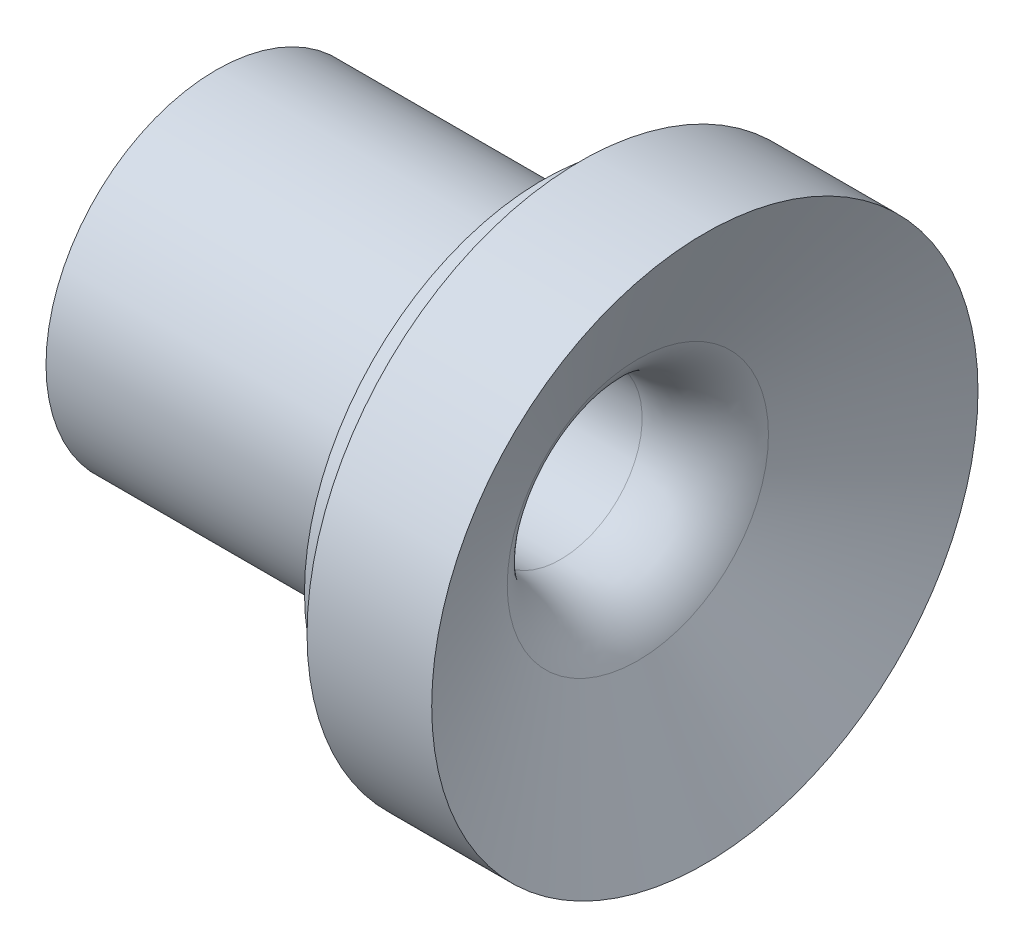
ISO-10303-21;
HEADER;
FILE_DESCRIPTION(('STEP AP214'),'2;1');
FILE_NAME('part.step','',(''),(''),'','','');
FILE_SCHEMA(('AUTOMOTIVE_DESIGN { 1 0 10303 214 1 1 1 1 }'));
ENDSEC;
DATA;
#1=APPLICATION_CONTEXT('core data for automotive mechanical design processes');
#2=APPLICATION_PROTOCOL_DEFINITION('international standard','automotive_design',2000,#1);
#3=PRODUCT_CONTEXT('',#1,'mechanical');
#4=PRODUCT('Part','Part','',(#3));
#5=PRODUCT_RELATED_PRODUCT_CATEGORY('part','',(#4));
#6=PRODUCT_DEFINITION_FORMATION('','',#4);
#7=PRODUCT_DEFINITION_CONTEXT('part definition',#1,'design');
#8=PRODUCT_DEFINITION('design','',#6,#7);
#9=PRODUCT_DEFINITION_SHAPE('','',#8);
#10=(LENGTH_UNIT() NAMED_UNIT(*) SI_UNIT(.MILLI.,.METRE.));
#11=(NAMED_UNIT(*) PLANE_ANGLE_UNIT() SI_UNIT($,.RADIAN.));
#12=(NAMED_UNIT(*) SI_UNIT($,.STERADIAN.) SOLID_ANGLE_UNIT());
#13=UNCERTAINTY_MEASURE_WITH_UNIT(LENGTH_MEASURE(1.E-05),#10,'distance_accuracy_value','');
#14=(GEOMETRIC_REPRESENTATION_CONTEXT(3) GLOBAL_UNCERTAINTY_ASSIGNED_CONTEXT((#13)) GLOBAL_UNIT_ASSIGNED_CONTEXT((#10,
#11,#12)) REPRESENTATION_CONTEXT('',''));
#15=CARTESIAN_POINT('',(0.,0.,0.));
#16=DIRECTION('',(0.,0.,1.));
#17=DIRECTION('',(1.,0.,0.));
#18=AXIS2_PLACEMENT_3D('',#15,#16,#17);
#19=CARTESIAN_POINT('',(4.26117287731068,15.2309957839257,0.));
#20=DIRECTION('',(1.,0.,0.));
#21=DIRECTION('',(0.,0.,-1.));
#22=AXIS2_PLACEMENT_3D('',#19,#20,#21);
#23=PLANE('',#22);
#24=CARTESIAN_POINT('',(4.26117287731068,-3.82202264007431,0.));
#25=DIRECTION('',(-1.,0.,0.));
#26=DIRECTION('',(0.,0.,1.));
#27=AXIS2_PLACEMENT_3D('',#24,#25,#26);
#28=CIRCLE('',#27,19.053018424);
#29=CARTESIAN_POINT('',(4.26117287731068,-3.82202264007431,19.053018424));
#30=VERTEX_POINT('',#29);
#31=EDGE_CURVE('E93',#30,#30,#28,.T.);
#32=ORIENTED_EDGE('',*,*,#31,.F.);
#33=EDGE_LOOP('',(#32));
#34=FACE_BOUND('',#33,.T.);
#35=CARTESIAN_POINT('',(4.26117287731068,-3.82202264007431,0.));
#36=DIRECTION('',(-1.,0.,0.));
#37=DIRECTION('',(0.,0.,1.));
#38=AXIS2_PLACEMENT_3D('',#35,#36,#37);
#39=CIRCLE('',#38,21.8372704);
#40=CARTESIAN_POINT('',(4.26117287731068,-3.82202264007431,21.8372704));
#41=VERTEX_POINT('',#40);
#42=EDGE_CURVE('E10',#41,#41,#39,.T.);
#43=ORIENTED_EDGE('',*,*,#42,.T.);
#44=EDGE_LOOP('',(#43));
#45=FACE_BOUND('',#44,.T.);
#46=ADVANCED_FACE('F38',(#34,#45),#23,.F.);
#47=CARTESIAN_POINT('',(-32.3479949938202,-3.82202264007431,0.));
#48=DIRECTION('',(-1.,0.,0.));
#49=DIRECTION('',(0.,0.,1.));
#50=AXIS2_PLACEMENT_3D('',#47,#48,#49);
#51=CYLINDRICAL_SURFACE('',#50,21.8372704);
#52=ORIENTED_EDGE('',*,*,#42,.F.);
#53=EDGE_LOOP('',(#52));
#54=FACE_BOUND('',#53,.T.);
#55=CARTESIAN_POINT('',(14.2274983634607,-3.82202264007431,0.));
#56=DIRECTION('',(-1.,0.,0.));
#57=DIRECTION('',(0.,0.,1.));
#58=AXIS2_PLACEMENT_3D('',#55,#56,#57);
#59=CIRCLE('',#58,21.8372704);
#60=CARTESIAN_POINT('',(14.2274983634607,-3.82202264007431,21.8372704));
#61=VERTEX_POINT('',#60);
#62=EDGE_CURVE('E45',#61,#61,#59,.T.);
#63=ORIENTED_EDGE('',*,*,#62,.T.);
#64=EDGE_LOOP('',(#63));
#65=FACE_BOUND('',#64,.T.);
#66=ADVANCED_FACE('F101',(#54,#65),#51,.T.);
#67=CARTESIAN_POINT('',(8.87115099573555,-3.82202264007431,0.));
#68=DIRECTION('',(1.,0.,0.));
#69=DIRECTION('',(0.,0.,-1.));
#70=AXIS2_PLACEMENT_3D('',#67,#68,#69);
#71=CONICAL_SURFACE('',#70,10.4417335755133,1.13140345075348);
#72=ORIENTED_EDGE('',*,*,#62,.F.);
#73=EDGE_LOOP('',(#72));
#74=FACE_BOUND('',#73,.T.);
#75=CARTESIAN_POINT('',(8.87115099573555,-3.82202264007431,0.));
#76=DIRECTION('',(-1.,0.,0.));
#77=DIRECTION('',(0.,0.,1.));
#78=AXIS2_PLACEMENT_3D('',#75,#76,#77);
#79=CIRCLE('',#78,10.4417335755133);
#80=CARTESIAN_POINT('',(8.87115099573555,-3.82202264007431,10.4417335755133));
#81=VERTEX_POINT('',#80);
#82=EDGE_CURVE('E50',#81,#81,#79,.T.);
#83=ORIENTED_EDGE('',*,*,#82,.T.);
#84=EDGE_LOOP('',(#83));
#85=FACE_BOUND('',#84,.T.);
#86=ADVANCED_FACE('F105',(#74,#85),#71,.F.);
#87=CARTESIAN_POINT('',(2.69522907429682,-3.82202264007431,0.));
#88=DIRECTION('',(-1.,0.,0.));
#89=DIRECTION('',(0.,0.,1.));
#90=AXIS2_PLACEMENT_3D('',#87,#88,#89);
#91=TOROIDAL_SURFACE('',#90,13.3446580832988,6.824147);
#92=ORIENTED_EDGE('',*,*,#82,.F.);
#93=EDGE_LOOP('',(#92));
#94=FACE_BOUND('',#93,.T.);
#95=CARTESIAN_POINT('',(2.69522907429681,-3.82202264007431,0.));
#96=DIRECTION('',(-1.,0.,0.));
#97=DIRECTION('',(0.,0.,1.));
#98=AXIS2_PLACEMENT_3D('',#95,#96,#97);
#99=CIRCLE('',#98,6.5205110832988);
#100=CARTESIAN_POINT('',(2.69522907429681,-3.82202264007431,6.5205110832988));
#101=VERTEX_POINT('',#100);
#102=EDGE_CURVE('E55',#101,#101,#99,.T.);
#103=ORIENTED_EDGE('',*,*,#102,.T.);
#104=EDGE_LOOP('',(#103));
#105=FACE_BOUND('',#104,.T.);
#106=ADVANCED_FACE('F110',(#94,#105),#91,.T.);
#107=CARTESIAN_POINT('',(-32.3479949938202,-3.82202264007431,0.));
#108=DIRECTION('',(-1.,0.,0.));
#109=DIRECTION('',(0.,0.,1.));
#110=AXIS2_PLACEMENT_3D('',#107,#108,#109);
#111=CYLINDRICAL_SURFACE('',#110,6.5205110832988);
#112=ORIENTED_EDGE('',*,*,#102,.F.);
#113=EDGE_LOOP('',(#112));
#114=FACE_BOUND('',#113,.T.);
#115=CARTESIAN_POINT('',(-7.71213424153933,-3.82202264007431,0.));
#116=DIRECTION('',(-1.,0.,0.));
#117=DIRECTION('',(0.,0.,1.));
#118=AXIS2_PLACEMENT_3D('',#115,#116,#117);
#119=CIRCLE('',#118,6.5205110832988);
#120=CARTESIAN_POINT('',(-7.71213424153933,-3.82202264007431,6.5205110832988));
#121=VERTEX_POINT('',#120);
#122=EDGE_CURVE('E61',#121,#121,#119,.T.);
#123=ORIENTED_EDGE('',*,*,#122,.T.);
#124=EDGE_LOOP('',(#123));
#125=FACE_BOUND('',#124,.T.);
#126=ADVANCED_FACE('F116',(#114,#125),#111,.F.);
#127=CARTESIAN_POINT('',(-24.8407432115393,-3.82202264007431,0.));
#128=DIRECTION('',(-1.,0.,0.));
#129=DIRECTION('',(0.,0.,1.));
#130=AXIS2_PLACEMENT_3D('',#127,#128,#129);
#131=CONICAL_SURFACE('',#130,9.6186351965,0.178939611606282);
#132=ORIENTED_EDGE('',*,*,#122,.F.);
#133=EDGE_LOOP('',(#132));
#134=FACE_BOUND('',#133,.T.);
#135=CARTESIAN_POINT('',(-24.8407432115393,-3.82202264007431,0.));
#136=DIRECTION('',(-1.,0.,0.));
#137=DIRECTION('',(0.,0.,1.));
#138=AXIS2_PLACEMENT_3D('',#135,#136,#137);
#139=CIRCLE('',#138,9.6186351965);
#140=CARTESIAN_POINT('',(-24.8407432115393,-3.82202264007431,9.6186351965));
#141=VERTEX_POINT('',#140);
#142=EDGE_CURVE('E65',#141,#141,#139,.T.);
#143=ORIENTED_EDGE('',*,*,#142,.T.);
#144=EDGE_LOOP('',(#143));
#145=FACE_BOUND('',#144,.T.);
#146=ADVANCED_FACE('F120',(#134,#145),#131,.F.);
#147=CARTESIAN_POINT('',(-24.8407432115393,5.79661255642569,0.));
#148=DIRECTION('',(1.,0.,0.));
#149=DIRECTION('',(0.,0.,-1.));
#150=AXIS2_PLACEMENT_3D('',#147,#148,#149);
#151=PLANE('',#150);
#152=ORIENTED_EDGE('',*,*,#142,.F.);
#153=EDGE_LOOP('',(#152));
#154=FACE_BOUND('',#153,.T.);
#155=CARTESIAN_POINT('',(-24.8407432115393,-3.82202264007431,0.));
#156=DIRECTION('',(-1.,0.,0.));
#157=DIRECTION('',(0.,0.,1.));
#158=AXIS2_PLACEMENT_3D('',#155,#156,#157);
#159=CIRCLE('',#158,13.6039370445);
#160=CARTESIAN_POINT('',(-24.8407432115393,-3.82202264007431,13.6039370445));
#161=VERTEX_POINT('',#160);
#162=EDGE_CURVE('E69',#161,#161,#159,.T.);
#163=ORIENTED_EDGE('',*,*,#162,.T.);
#164=EDGE_LOOP('',(#163));
#165=FACE_BOUND('',#164,.T.);
#166=ADVANCED_FACE('F124',(#154,#165),#151,.F.);
#167=CARTESIAN_POINT('',(-32.3479949938202,-3.82202264007431,0.));
#168=DIRECTION('',(-1.,0.,0.));
#169=DIRECTION('',(0.,0.,1.));
#170=AXIS2_PLACEMENT_3D('',#167,#168,#169);
#171=CYLINDRICAL_SURFACE('',#170,13.6039370445);
#172=ORIENTED_EDGE('',*,*,#162,.F.);
#173=EDGE_LOOP('',(#172));
#174=FACE_BOUND('',#173,.T.);
#175=CARTESIAN_POINT('',(-2.53255588710358,-3.82202264007431,0.));
#176=DIRECTION('',(-1.,0.,0.));
#177=DIRECTION('',(0.,0.,1.));
#178=AXIS2_PLACEMENT_3D('',#175,#176,#177);
#179=CIRCLE('',#178,13.6039370445);
#180=CARTESIAN_POINT('',(-2.53255588710358,-3.82202264007431,13.6039370445));
#181=VERTEX_POINT('',#180);
#182=EDGE_CURVE('E73',#181,#181,#179,.T.);
#183=ORIENTED_EDGE('',*,*,#182,.T.);
#184=EDGE_LOOP('',(#183));
#185=FACE_BOUND('',#184,.T.);
#186=ADVANCED_FACE('F128',(#174,#185),#171,.T.);
#187=CARTESIAN_POINT('',(-2.53255588710358,-3.82202264007431,0.));
#188=DIRECTION('',(-1.,0.,0.));
#189=DIRECTION('',(0.,0.,1.));
#190=AXIS2_PLACEMENT_3D('',#187,#188,#189);
#191=TOROIDAL_SURFACE('',#190,15.3099737945,1.70603675);
#192=ORIENTED_EDGE('',*,*,#182,.F.);
#193=EDGE_LOOP('',(#192));
#194=FACE_BOUND('',#193,.T.);
#195=CARTESIAN_POINT('',(-1.43593660253368,-3.82202264007431,0.));
#196=DIRECTION('',(-1.,0.,0.));
#197=DIRECTION('',(0.,0.,1.));
#198=AXIS2_PLACEMENT_3D('',#195,#196,#197);
#199=CIRCLE('',#198,14.0030738224057);
#200=CARTESIAN_POINT('',(-1.43593660253368,-3.82202264007431,14.0030738224057));
#201=VERTEX_POINT('',#200);
#202=EDGE_CURVE('E77',#201,#201,#199,.T.);
#203=ORIENTED_EDGE('',*,*,#202,.T.);
#204=EDGE_LOOP('',(#203));
#205=FACE_BOUND('',#204,.T.);
#206=ADVANCED_FACE('F132',(#194,#205),#191,.F.);
#207=CARTESIAN_POINT('',(0.661755403830574,-3.82202264007431,0.));
#208=DIRECTION('',(1.,0.,0.));
#209=DIRECTION('',(0.,0.,-1.));
#210=AXIS2_PLACEMENT_3D('',#207,#208,#209);
#211=CONICAL_SURFACE('',#210,15.7632464112695,0.698131700797733);
#212=ORIENTED_EDGE('',*,*,#202,.F.);
#213=EDGE_LOOP('',(#212));
#214=FACE_BOUND('',#213,.T.);
#215=CARTESIAN_POINT('',(0.661755403830574,-3.82202264007431,0.));
#216=DIRECTION('',(-1.,0.,0.));
#217=DIRECTION('',(0.,0.,1.));
#218=AXIS2_PLACEMENT_3D('',#215,#216,#217);
#219=CIRCLE('',#218,15.7632464112695);
#220=CARTESIAN_POINT('',(0.661755403830574,-3.82202264007431,15.7632464112695));
#221=VERTEX_POINT('',#220);
#222=EDGE_CURVE('E81',#221,#221,#219,.T.);
#223=ORIENTED_EDGE('',*,*,#222,.T.);
#224=EDGE_LOOP('',(#223));
#225=FACE_BOUND('',#224,.T.);
#226=ADVANCED_FACE('F136',(#214,#225),#211,.T.);
#227=CARTESIAN_POINT('',(-0.434863880739318,-3.82202264007431,0.));
#228=DIRECTION('',(-1.,0.,0.));
#229=DIRECTION('',(0.,0.,1.));
#230=AXIS2_PLACEMENT_3D('',#227,#228,#229);
#231=TOROIDAL_SURFACE('',#230,17.0701463833638,1.70603675);
#232=ORIENTED_EDGE('',*,*,#222,.F.);
#233=EDGE_LOOP('',(#232));
#234=FACE_BOUND('',#233,.T.);
#235=CARTESIAN_POINT('',(1.27117286926068,-3.82202264007431,0.));
#236=DIRECTION('',(-1.,0.,0.));
#237=DIRECTION('',(0.,0.,1.));
#238=AXIS2_PLACEMENT_3D('',#235,#236,#237);
#239=CIRCLE('',#238,17.0701463833638);
#240=CARTESIAN_POINT('',(1.27117286926068,-3.82202264007431,17.0701463833638));
#241=VERTEX_POINT('',#240);
#242=EDGE_CURVE('E85',#241,#241,#239,.T.);
#243=ORIENTED_EDGE('',*,*,#242,.T.);
#244=EDGE_LOOP('',(#243));
#245=FACE_BOUND('',#244,.T.);
#246=ADVANCED_FACE('F140',(#234,#245),#231,.F.);
#247=CARTESIAN_POINT('',(1.27117286926068,13.2481237432895,0.));
#248=DIRECTION('',(1.,0.,0.));
#249=DIRECTION('',(0.,0.,-1.));
#250=AXIS2_PLACEMENT_3D('',#247,#248,#249);
#251=PLANE('',#250);
#252=ORIENTED_EDGE('',*,*,#242,.F.);
#253=EDGE_LOOP('',(#252));
#254=FACE_BOUND('',#253,.T.);
#255=CARTESIAN_POINT('',(1.27117286926068,-3.82202264007431,0.));
#256=DIRECTION('',(-1.,0.,0.));
#257=DIRECTION('',(0.,0.,1.));
#258=AXIS2_PLACEMENT_3D('',#255,#256,#257);
#259=CIRCLE('',#258,19.053018424);
#260=CARTESIAN_POINT('',(1.27117286926068,-3.82202264007431,19.053018424));
#261=VERTEX_POINT('',#260);
#262=EDGE_CURVE('E89',#261,#261,#259,.T.);
#263=ORIENTED_EDGE('',*,*,#262,.T.);
#264=EDGE_LOOP('',(#263));
#265=FACE_BOUND('',#264,.T.);
#266=ADVANCED_FACE('F144',(#254,#265),#251,.F.);
#267=CARTESIAN_POINT('',(-32.3479949938202,-3.82202264007431,0.));
#268=DIRECTION('',(-1.,0.,0.));
#269=DIRECTION('',(0.,0.,1.));
#270=AXIS2_PLACEMENT_3D('',#267,#268,#269);
#271=CYLINDRICAL_SURFACE('',#270,19.053018424);
#272=ORIENTED_EDGE('',*,*,#262,.F.);
#273=EDGE_LOOP('',(#272));
#274=FACE_BOUND('',#273,.T.);
#275=ORIENTED_EDGE('',*,*,#31,.T.);
#276=EDGE_LOOP('',(#275));
#277=FACE_BOUND('',#276,.T.);
#278=ADVANCED_FACE('F98',(#274,#277),#271,.T.);
#279=CLOSED_SHELL('',(#46,#66,#86,#106,#126,#146,#166,#186,#206,#226,#246,#266,#278));
#280=MANIFOLD_SOLID_BREP('B2',#279);
#281=ADVANCED_BREP_SHAPE_REPRESENTATION('',(#18,#280),#14);
#282=SHAPE_DEFINITION_REPRESENTATION(#9,#281);
ENDSEC;
END-ISO-10303-21;
